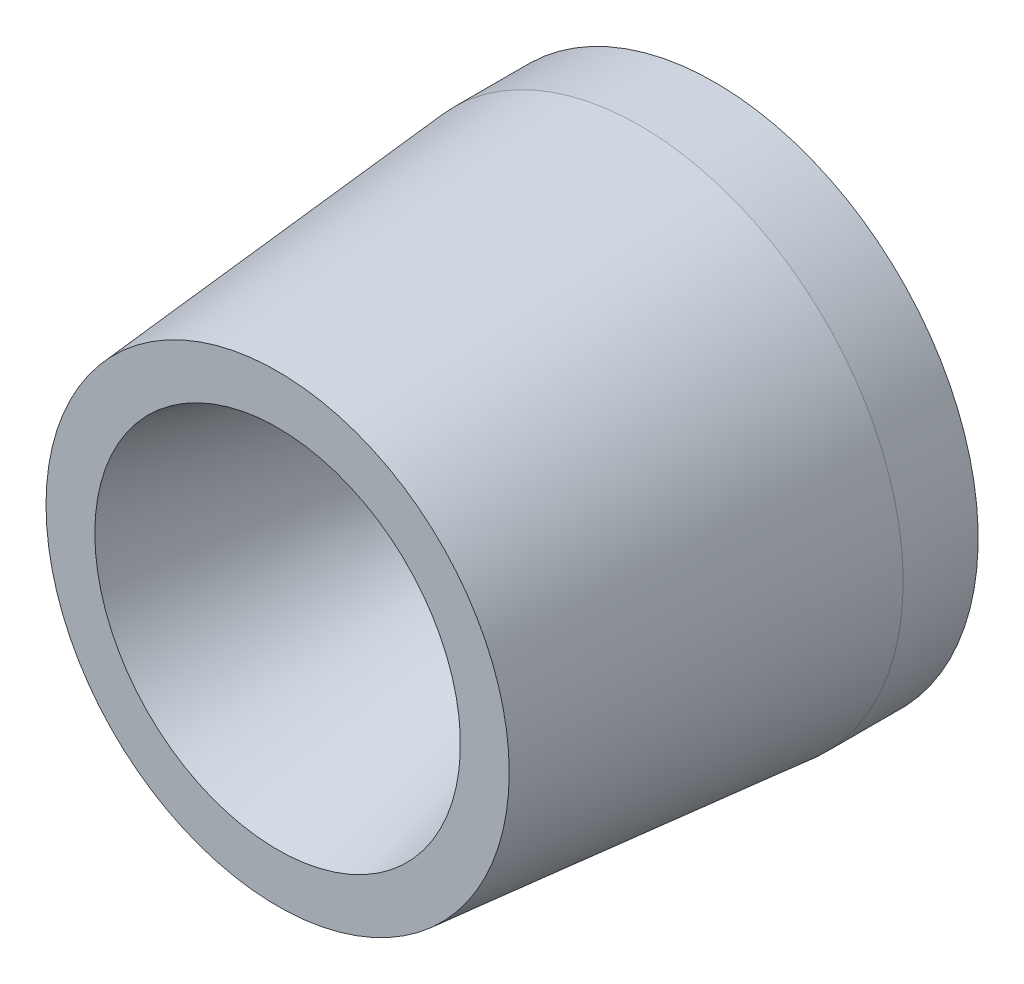
ISO-10303-21;
HEADER;
FILE_DESCRIPTION(('STEP AP214'),'2;1');
FILE_NAME('part.step','',(''),(''),'','','');
FILE_SCHEMA(('AUTOMOTIVE_DESIGN { 1 0 10303 214 1 1 1 1 }'));
ENDSEC;
DATA;
#1=APPLICATION_CONTEXT('core data for automotive mechanical design processes');
#2=APPLICATION_PROTOCOL_DEFINITION('international standard','automotive_design',2000,#1);
#3=PRODUCT_CONTEXT('',#1,'mechanical');
#4=PRODUCT('Part','Part','',(#3));
#5=PRODUCT_RELATED_PRODUCT_CATEGORY('part','',(#4));
#6=PRODUCT_DEFINITION_FORMATION('','',#4);
#7=PRODUCT_DEFINITION_CONTEXT('part definition',#1,'design');
#8=PRODUCT_DEFINITION('design','',#6,#7);
#9=PRODUCT_DEFINITION_SHAPE('','',#8);
#10=(LENGTH_UNIT() NAMED_UNIT(*) SI_UNIT(.MILLI.,.METRE.));
#11=(NAMED_UNIT(*) PLANE_ANGLE_UNIT() SI_UNIT($,.RADIAN.));
#12=(NAMED_UNIT(*) SI_UNIT($,.STERADIAN.) SOLID_ANGLE_UNIT());
#13=UNCERTAINTY_MEASURE_WITH_UNIT(LENGTH_MEASURE(1.E-05),#10,'distance_accuracy_value','');
#14=(GEOMETRIC_REPRESENTATION_CONTEXT(3) GLOBAL_UNCERTAINTY_ASSIGNED_CONTEXT((#13)) GLOBAL_UNIT_ASSIGNED_CONTEXT((#10,
#11,#12)) REPRESENTATION_CONTEXT('',''));
#15=CARTESIAN_POINT('',(0.,0.,0.));
#16=DIRECTION('',(0.,0.,1.));
#17=DIRECTION('',(1.,0.,0.));
#18=AXIS2_PLACEMENT_3D('',#15,#16,#17);
#19=CARTESIAN_POINT('',(38.9876435433738,0.,-69.85));
#20=DIRECTION('',(0.,0.,-1.));
#21=DIRECTION('',(-1.,0.,0.));
#22=AXIS2_PLACEMENT_3D('',#19,#20,#21);
#23=PLANE('',#22);
#24=CARTESIAN_POINT('',(0.,0.,-69.85));
#25=DIRECTION('',(0.,0.,-1.));
#26=DIRECTION('',(-1.,0.,0.));
#27=AXIS2_PLACEMENT_3D('',#24,#25,#26);
#28=CIRCLE('',#27,38.9876435433738);
#29=CARTESIAN_POINT('',(-38.9876435433738,0.,-69.85));
#30=VERTEX_POINT('',#29);
#31=EDGE_CURVE('E10',#30,#30,#28,.T.);
#32=ORIENTED_EDGE('',*,*,#31,.F.);
#33=EDGE_LOOP('',(#32));
#34=FACE_BOUND('',#33,.T.);
#35=CARTESIAN_POINT('',(0.,0.,-69.85));
#36=DIRECTION('',(0.,0.,-1.));
#37=DIRECTION('',(-1.,0.,0.));
#38=AXIS2_PLACEMENT_3D('',#35,#36,#37);
#39=CIRCLE('',#38,30.7727205497655);
#40=CARTESIAN_POINT('',(-30.7727205497655,0.,-69.85));
#41=VERTEX_POINT('',#40);
#42=EDGE_CURVE('E66',#41,#41,#39,.T.);
#43=ORIENTED_EDGE('',*,*,#42,.T.);
#44=EDGE_LOOP('',(#43));
#45=FACE_BOUND('',#44,.T.);
#46=ADVANCED_FACE('F43',(#34,#45),#23,.F.);
#47=CARTESIAN_POINT('',(0.,0.,-146.817261675635));
#48=DIRECTION('',(0.,0.,-1.));
#49=DIRECTION('',(-1.,0.,0.));
#50=AXIS2_PLACEMENT_3D('',#47,#48,#49);
#51=CYLINDRICAL_SURFACE('',#50,18.415);
#52=CARTESIAN_POINT('',(0.,0.,-115.969640957463));
#53=DIRECTION('',(0.,0.,-1.));
#54=DIRECTION('',(-1.,0.,0.));
#55=AXIS2_PLACEMENT_3D('',#52,#53,#54);
#56=CIRCLE('',#55,18.415);
#57=CARTESIAN_POINT('',(-18.415,0.,-115.969640957463));
#58=VERTEX_POINT('',#57);
#59=EDGE_CURVE('E60',#58,#58,#56,.T.);
#60=ORIENTED_EDGE('',*,*,#59,.F.);
#61=EDGE_LOOP('',(#60));
#62=FACE_BOUND('',#61,.T.);
#63=CARTESIAN_POINT('',(0.,0.,-129.963013838753));
#64=DIRECTION('',(0.,0.,-1.));
#65=DIRECTION('',(-1.,0.,0.));
#66=AXIS2_PLACEMENT_3D('',#63,#64,#65);
#67=CIRCLE('',#66,18.415);
#68=CARTESIAN_POINT('',(-18.415,0.,-129.963013838753));
#69=VERTEX_POINT('',#68);
#70=EDGE_CURVE('E74',#69,#69,#67,.T.);
#71=ORIENTED_EDGE('',*,*,#70,.T.);
#72=EDGE_LOOP('',(#71));
#73=FACE_BOUND('',#72,.T.);
#74=ADVANCED_FACE('F79',(#62,#73),#51,.F.);
#75=CARTESIAN_POINT('',(0.,0.,-146.817261675635));
#76=DIRECTION('',(0.,0.,-1.));
#77=DIRECTION('',(-1.,0.,0.));
#78=AXIS2_PLACEMENT_3D('',#75,#76,#77);
#79=CYLINDRICAL_SURFACE('',#78,44.323);
#80=CARTESIAN_POINT('',(0.,0.,-143.454534929176));
#81=DIRECTION('',(0.,0.,-1.));
#82=DIRECTION('',(-1.,0.,0.));
#83=AXIS2_PLACEMENT_3D('',#80,#81,#82);
#84=CIRCLE('',#83,44.323);
#85=CARTESIAN_POINT('',(-44.323,0.,-143.454534929176));
#86=VERTEX_POINT('',#85);
#87=EDGE_CURVE('E50',#86,#86,#84,.T.);
#88=ORIENTED_EDGE('',*,*,#87,.F.);
#89=EDGE_LOOP('',(#88));
#90=FACE_BOUND('',#89,.T.);
#91=CARTESIAN_POINT('',(0.,0.,-130.833403353112));
#92=DIRECTION('',(0.,0.,-1.));
#93=DIRECTION('',(-1.,0.,0.));
#94=AXIS2_PLACEMENT_3D('',#91,#92,#93);
#95=CIRCLE('',#94,44.323);
#96=CARTESIAN_POINT('',(-44.323,0.,-130.833403353112));
#97=VERTEX_POINT('',#96);
#98=EDGE_CURVE('E55',#97,#97,#95,.T.);
#99=ORIENTED_EDGE('',*,*,#98,.T.);
#100=EDGE_LOOP('',(#99));
#101=FACE_BOUND('',#100,.T.);
#102=ADVANCED_FACE('F102',(#90,#101),#79,.T.);
#103=CARTESIAN_POINT('',(0.,0.,-76.2));
#104=DIRECTION('',(0.,0.,-1.));
#105=DIRECTION('',(-1.,0.,0.));
#106=AXIS2_PLACEMENT_3D('',#103,#104,#105);
#107=CONICAL_SURFACE('',#106,39.5431965567634,0.0872664626004255);
#108=ORIENTED_EDGE('',*,*,#98,.F.);
#109=EDGE_LOOP('',(#108));
#110=FACE_BOUND('',#109,.T.);
#111=ORIENTED_EDGE('',*,*,#31,.T.);
#112=EDGE_LOOP('',(#111));
#113=FACE_BOUND('',#112,.T.);
#114=ADVANCED_FACE('F94',(#110,#113),#107,.T.);
#115=CARTESIAN_POINT('',(0.,0.,-115.969640957463));
#116=DIRECTION('',(0.,0.,1.));
#117=DIRECTION('',(1.,0.,0.));
#118=AXIS2_PLACEMENT_3D('',#115,#116,#117);
#119=CONICAL_SURFACE('',#118,18.415,0.26179938779915);
#120=ORIENTED_EDGE('',*,*,#42,.F.);
#121=EDGE_LOOP('',(#120));
#122=FACE_BOUND('',#121,.T.);
#123=ORIENTED_EDGE('',*,*,#59,.T.);
#124=EDGE_LOOP('',(#123));
#125=FACE_BOUND('',#124,.T.);
#126=ADVANCED_FACE('F89',(#122,#125),#119,.F.);
#127=CARTESIAN_POINT('',(44.323,0.,-143.454534929176));
#128=DIRECTION('',(0.,0.,1.));
#129=DIRECTION('',(1.,0.,0.));
#130=AXIS2_PLACEMENT_3D('',#127,#128,#129);
#131=PLANE('',#130);
#132=CARTESIAN_POINT('',(0.,0.,-143.454534929176));
#133=DIRECTION('',(0.,0.,-1.));
#134=DIRECTION('',(-1.,0.,0.));
#135=AXIS2_PLACEMENT_3D('',#132,#133,#134);
#136=CIRCLE('',#135,41.783);
#137=CARTESIAN_POINT('',(-41.783,0.,-143.454534929176));
#138=VERTEX_POINT('',#137);
#139=EDGE_CURVE('E70',#138,#138,#136,.T.);
#140=ORIENTED_EDGE('',*,*,#139,.F.);
#141=EDGE_LOOP('',(#140));
#142=FACE_BOUND('',#141,.T.);
#143=ORIENTED_EDGE('',*,*,#87,.T.);
#144=EDGE_LOOP('',(#143));
#145=FACE_BOUND('',#144,.T.);
#146=ADVANCED_FACE('F84',(#142,#145),#131,.F.);
#147=CARTESIAN_POINT('',(0.,0.,-143.454534929176));
#148=DIRECTION('',(0.,0.,-1.));
#149=DIRECTION('',(-1.,0.,0.));
#150=AXIS2_PLACEMENT_3D('',#147,#148,#149);
#151=CONICAL_SURFACE('',#150,41.783,1.0471975511966);
#152=ORIENTED_EDGE('',*,*,#70,.F.);
#153=EDGE_LOOP('',(#152));
#154=FACE_BOUND('',#153,.T.);
#155=ORIENTED_EDGE('',*,*,#139,.T.);
#156=EDGE_LOOP('',(#155));
#157=FACE_BOUND('',#156,.T.);
#158=ADVANCED_FACE('F81',(#154,#157),#151,.F.);
#159=CLOSED_SHELL('',(#46,#74,#102,#114,#126,#146,#158));
#160=MANIFOLD_SOLID_BREP('B2',#159);
#161=ADVANCED_BREP_SHAPE_REPRESENTATION('',(#18,#160),#14);
#162=SHAPE_DEFINITION_REPRESENTATION(#9,#161);
ENDSEC;
END-ISO-10303-21;
